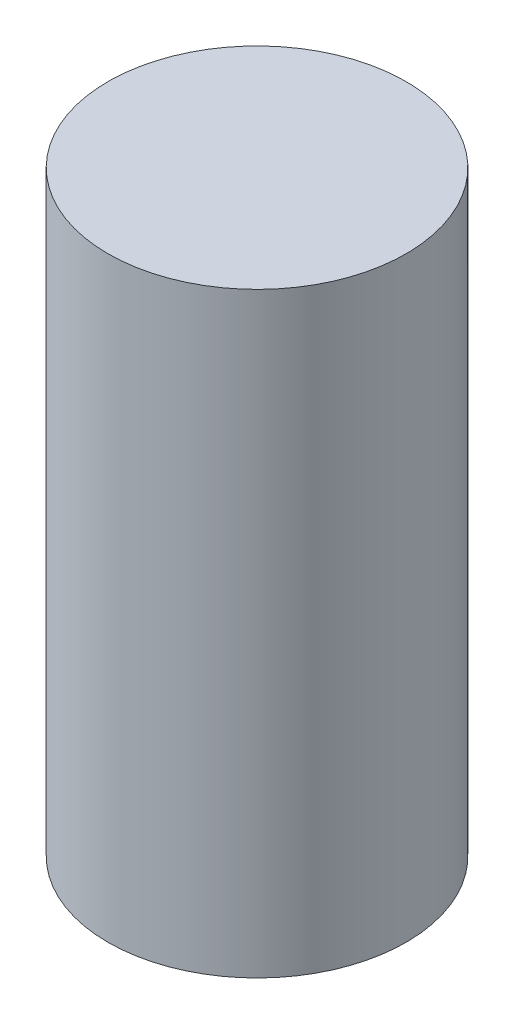
ISO-10303-21;
HEADER;
FILE_DESCRIPTION(('STEP AP214'),'2;1');
FILE_NAME('part.step','',(''),(''),'','','');
FILE_SCHEMA(('AUTOMOTIVE_DESIGN { 1 0 10303 214 1 1 1 1 }'));
ENDSEC;
DATA;
#1=APPLICATION_CONTEXT('core data for automotive mechanical design processes');
#2=APPLICATION_PROTOCOL_DEFINITION('international standard','automotive_design',2000,#1);
#3=PRODUCT_CONTEXT('',#1,'mechanical');
#4=PRODUCT('Part','Part','',(#3));
#5=PRODUCT_RELATED_PRODUCT_CATEGORY('part','',(#4));
#6=PRODUCT_DEFINITION_FORMATION('','',#4);
#7=PRODUCT_DEFINITION_CONTEXT('part definition',#1,'design');
#8=PRODUCT_DEFINITION('design','',#6,#7);
#9=PRODUCT_DEFINITION_SHAPE('','',#8);
#10=(LENGTH_UNIT() NAMED_UNIT(*) SI_UNIT(.MILLI.,.METRE.));
#11=(NAMED_UNIT(*) PLANE_ANGLE_UNIT() SI_UNIT($,.RADIAN.));
#12=(NAMED_UNIT(*) SI_UNIT($,.STERADIAN.) SOLID_ANGLE_UNIT());
#13=UNCERTAINTY_MEASURE_WITH_UNIT(LENGTH_MEASURE(1.E-05),#10,'distance_accuracy_value','');
#14=(GEOMETRIC_REPRESENTATION_CONTEXT(3) GLOBAL_UNCERTAINTY_ASSIGNED_CONTEXT((#13)) GLOBAL_UNIT_ASSIGNED_CONTEXT((#10,
#11,#12)) REPRESENTATION_CONTEXT('',''));
#15=CARTESIAN_POINT('',(0.,0.,0.));
#16=DIRECTION('',(0.,0.,1.));
#17=DIRECTION('',(1.,0.,0.));
#18=AXIS2_PLACEMENT_3D('',#15,#16,#17);
#19=CARTESIAN_POINT('',(0.,165.1,0.));
#20=DIRECTION('',(0.,-1.,0.));
#21=DIRECTION('',(0.,0.,-1.));
#22=AXIS2_PLACEMENT_3D('',#19,#20,#21);
#23=CYLINDRICAL_SURFACE('',#22,41.275);
#24=CARTESIAN_POINT('',(0.,165.1,0.));
#25=DIRECTION('',(0.,1.,0.));
#26=DIRECTION('',(0.,0.,1.));
#27=AXIS2_PLACEMENT_3D('',#24,#25,#26);
#28=CIRCLE('',#27,41.275);
#29=CARTESIAN_POINT('',(0.,165.1,41.275));
#30=VERTEX_POINT('',#29);
#31=EDGE_CURVE('E10',#30,#30,#28,.T.);
#32=ORIENTED_EDGE('',*,*,#31,.F.);
#33=EDGE_LOOP('',(#32));
#34=FACE_BOUND('',#33,.T.);
#35=CARTESIAN_POINT('',(0.,0.,0.));
#36=DIRECTION('',(0.,1.,0.));
#37=DIRECTION('',(0.,0.,1.));
#38=AXIS2_PLACEMENT_3D('',#35,#36,#37);
#39=CIRCLE('',#38,41.275);
#40=CARTESIAN_POINT('',(0.,0.,41.275));
#41=VERTEX_POINT('',#40);
#42=EDGE_CURVE('E40',#41,#41,#39,.T.);
#43=ORIENTED_EDGE('',*,*,#42,.T.);
#44=EDGE_LOOP('',(#43));
#45=FACE_BOUND('',#44,.T.);
#46=ADVANCED_FACE('F37',(#34,#45),#23,.T.);
#47=CARTESIAN_POINT('',(0.,165.1,0.));
#48=DIRECTION('',(0.,1.,0.));
#49=DIRECTION('',(0.,0.,1.));
#50=AXIS2_PLACEMENT_3D('',#47,#48,#49);
#51=PLANE('',#50);
#52=ORIENTED_EDGE('',*,*,#31,.T.);
#53=EDGE_LOOP('',(#52));
#54=FACE_BOUND('',#53,.T.);
#55=ADVANCED_FACE('F52',(#54),#51,.T.);
#56=CARTESIAN_POINT('',(0.,0.,0.));
#57=DIRECTION('',(0.,1.,0.));
#58=DIRECTION('',(0.,0.,1.));
#59=AXIS2_PLACEMENT_3D('',#56,#57,#58);
#60=PLANE('',#59);
#61=ORIENTED_EDGE('',*,*,#42,.F.);
#62=EDGE_LOOP('',(#61));
#63=FACE_BOUND('',#62,.T.);
#64=ADVANCED_FACE('F50',(#63),#60,.F.);
#65=CLOSED_SHELL('',(#46,#55,#64));
#66=MANIFOLD_SOLID_BREP('B2',#65);
#67=ADVANCED_BREP_SHAPE_REPRESENTATION('',(#18,#66),#14);
#68=SHAPE_DEFINITION_REPRESENTATION(#9,#67);
ENDSEC;
END-ISO-10303-21;
